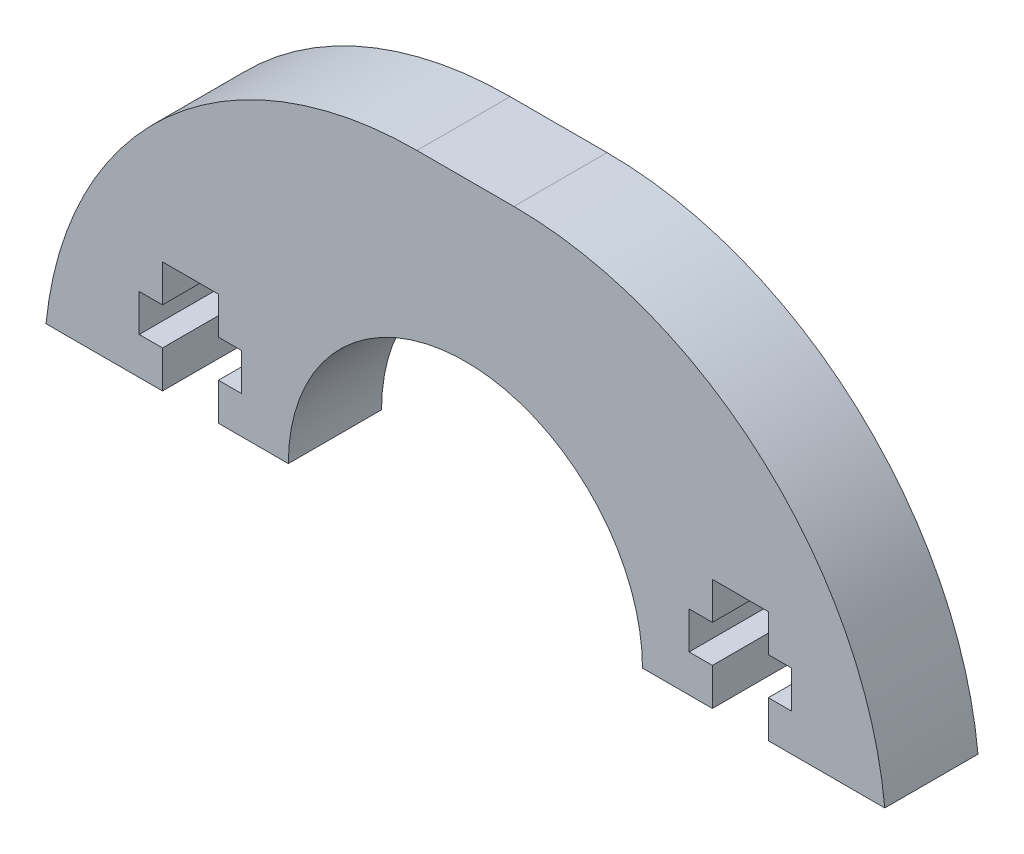
ISO-10303-21;
HEADER;
FILE_DESCRIPTION(('STEP AP214'),'2;1');
FILE_NAME('part.step','',(''),(''),'','','');
FILE_SCHEMA(('AUTOMOTIVE_DESIGN { 1 0 10303 214 1 1 1 1 }'));
ENDSEC;
DATA;
#1=APPLICATION_CONTEXT('core data for automotive mechanical design processes');
#2=APPLICATION_PROTOCOL_DEFINITION('international standard','automotive_design',2000,#1);
#3=PRODUCT_CONTEXT('',#1,'mechanical');
#4=PRODUCT('Part','Part','',(#3));
#5=PRODUCT_RELATED_PRODUCT_CATEGORY('part','',(#4));
#6=PRODUCT_DEFINITION_FORMATION('','',#4);
#7=PRODUCT_DEFINITION_CONTEXT('part definition',#1,'design');
#8=PRODUCT_DEFINITION('design','',#6,#7);
#9=PRODUCT_DEFINITION_SHAPE('','',#8);
#10=(LENGTH_UNIT() NAMED_UNIT(*) SI_UNIT(.MILLI.,.METRE.));
#11=(NAMED_UNIT(*) PLANE_ANGLE_UNIT() SI_UNIT($,.RADIAN.));
#12=(NAMED_UNIT(*) SI_UNIT($,.STERADIAN.) SOLID_ANGLE_UNIT());
#13=UNCERTAINTY_MEASURE_WITH_UNIT(LENGTH_MEASURE(1.E-05),#10,'distance_accuracy_value','');
#14=(GEOMETRIC_REPRESENTATION_CONTEXT(3) GLOBAL_UNCERTAINTY_ASSIGNED_CONTEXT((#13)) GLOBAL_UNIT_ASSIGNED_CONTEXT((#10,
#11,#12)) REPRESENTATION_CONTEXT('',''));
#15=CARTESIAN_POINT('',(0.,0.,0.));
#16=DIRECTION('',(0.,0.,1.));
#17=DIRECTION('',(1.,0.,0.));
#18=AXIS2_PLACEMENT_3D('',#15,#16,#17);
#19=CARTESIAN_POINT('',(0.,-9.,5.));
#20=DIRECTION('',(0.,0.,-1.));
#21=DIRECTION('',(-1.,0.,0.));
#22=AXIS2_PLACEMENT_3D('',#19,#20,#21);
#23=CYLINDRICAL_SURFACE('',#22,9.5);
#24=CARTESIAN_POINT('',(0.,-9.,0.));
#25=DIRECTION('',(0.,0.,1.));
#26=DIRECTION('',(1.,0.,0.));
#27=AXIS2_PLACEMENT_3D('',#24,#25,#26);
#28=CIRCLE('',#27,9.5);
#29=CARTESIAN_POINT('',(9.5,-8.99999999999999,0.));
#30=VERTEX_POINT('',#29);
#31=CARTESIAN_POINT('',(-9.5,-8.99999999999999,0.));
#32=VERTEX_POINT('',#31);
#33=EDGE_CURVE('E234',#30,#32,#28,.T.);
#34=ORIENTED_EDGE('',*,*,#33,.F.);
#35=DIRECTION('',(0.,0.,-1.));
#36=VECTOR('',#35,1.);
#37=CARTESIAN_POINT('',(9.5,-8.99999999999999,5.));
#38=LINE('',#37,#36);
#39=CARTESIAN_POINT('',(9.5,-8.99999999999999,5.));
#40=VERTEX_POINT('',#39);
#41=EDGE_CURVE('E229',#40,#30,#38,.T.);
#42=ORIENTED_EDGE('',*,*,#41,.F.);
#43=CARTESIAN_POINT('',(0.,-9.,5.));
#44=DIRECTION('',(0.,0.,1.));
#45=DIRECTION('',(1.,0.,0.));
#46=AXIS2_PLACEMENT_3D('',#43,#44,#45);
#47=CIRCLE('',#46,9.5);
#48=CARTESIAN_POINT('',(-9.5,-8.99999999999999,5.));
#49=VERTEX_POINT('',#48);
#50=EDGE_CURVE('E231',#40,#49,#47,.T.);
#51=ORIENTED_EDGE('',*,*,#50,.T.);
#52=DIRECTION('',(0.,0.,-1.));
#53=VECTOR('',#52,1.);
#54=CARTESIAN_POINT('',(-9.5,-8.99999999999999,5.));
#55=LINE('',#54,#53);
#56=EDGE_CURVE('E257',#49,#32,#55,.T.);
#57=ORIENTED_EDGE('',*,*,#56,.T.);
#58=EDGE_LOOP('',(#34,#42,#51,#57));
#59=FACE_BOUND('',#58,.T.);
#60=ADVANCED_FACE('F32',(#59),#23,.F.);
#61=CARTESIAN_POINT('',(0.,-8.99999999999999,5.));
#62=DIRECTION('',(0.,-1.,0.));
#63=DIRECTION('',(1.,0.,0.));
#64=AXIS2_PLACEMENT_3D('',#61,#62,#63);
#65=PLANE('',#64);
#66=DIRECTION('',(-1.,0.,0.));
#67=VECTOR('',#66,1.);
#68=CARTESIAN_POINT('',(0.,-8.99999999999999,0.));
#69=LINE('',#68,#67);
#70=CARTESIAN_POINT('',(13.2500000000001,-8.99999999999999,0.));
#71=VERTEX_POINT('',#70);
#72=EDGE_CURVE('E406',#71,#30,#69,.T.);
#73=ORIENTED_EDGE('',*,*,#72,.F.);
#74=DIRECTION('',(0.,0.,-1.));
#75=VECTOR('',#74,1.);
#76=CARTESIAN_POINT('',(13.2500000000001,-8.99999999999999,5.));
#77=LINE('',#76,#75);
#78=CARTESIAN_POINT('',(13.2500000000001,-8.99999999999999,5.));
#79=VERTEX_POINT('',#78);
#80=EDGE_CURVE('E239',#79,#71,#77,.T.);
#81=ORIENTED_EDGE('',*,*,#80,.F.);
#82=DIRECTION('',(-1.,0.,0.));
#83=VECTOR('',#82,1.);
#84=CARTESIAN_POINT('',(0.,-8.99999999999999,5.));
#85=LINE('',#84,#83);
#86=EDGE_CURVE('E244',#79,#40,#85,.T.);
#87=ORIENTED_EDGE('',*,*,#86,.T.);
#88=ORIENTED_EDGE('',*,*,#41,.T.);
#89=EDGE_LOOP('',(#73,#81,#87,#88));
#90=FACE_BOUND('',#89,.T.);
#91=ADVANCED_FACE('F250',(#90),#65,.T.);
#92=CARTESIAN_POINT('',(13.2500000000001,-37.8394982302636,5.));
#93=DIRECTION('',(1.,0.,0.));
#94=DIRECTION('',(0.,0.,-1.));
#95=AXIS2_PLACEMENT_3D('',#92,#93,#94);
#96=PLANE('',#95);
#97=DIRECTION('',(0.,-1.,0.));
#98=VECTOR('',#97,1.);
#99=CARTESIAN_POINT('',(13.2500000000001,-37.8394982302636,0.));
#100=LINE('',#99,#98);
#101=CARTESIAN_POINT('',(13.2500000000001,-6.99999999999999,0.));
#102=VERTEX_POINT('',#101);
#103=EDGE_CURVE('E419',#102,#71,#100,.T.);
#104=ORIENTED_EDGE('',*,*,#103,.F.);
#105=DIRECTION('',(0.,0.,-1.));
#106=VECTOR('',#105,1.);
#107=CARTESIAN_POINT('',(13.2500000000001,-6.99999999999999,5.));
#108=LINE('',#107,#106);
#109=CARTESIAN_POINT('',(13.2500000000001,-6.99999999999999,5.));
#110=VERTEX_POINT('',#109);
#111=EDGE_CURVE('E376',#110,#102,#108,.T.);
#112=ORIENTED_EDGE('',*,*,#111,.F.);
#113=DIRECTION('',(0.,-1.,0.));
#114=VECTOR('',#113,1.);
#115=CARTESIAN_POINT('',(13.2500000000001,-37.8394982302636,5.));
#116=LINE('',#115,#114);
#117=EDGE_CURVE('E251',#110,#79,#116,.T.);
#118=ORIENTED_EDGE('',*,*,#117,.T.);
#119=ORIENTED_EDGE('',*,*,#80,.T.);
#120=EDGE_LOOP('',(#104,#112,#118,#119));
#121=FACE_BOUND('',#120,.T.);
#122=ADVANCED_FACE('F503',(#121),#96,.T.);
#123=CARTESIAN_POINT('',(0.,-6.99999999999999,5.));
#124=DIRECTION('',(0.,1.,0.));
#125=DIRECTION('',(0.,0.,1.));
#126=AXIS2_PLACEMENT_3D('',#123,#124,#125);
#127=PLANE('',#126);
#128=DIRECTION('',(1.,0.,0.));
#129=VECTOR('',#128,1.);
#130=CARTESIAN_POINT('',(0.,-6.99999999999999,0.));
#131=LINE('',#130,#129);
#132=CARTESIAN_POINT('',(12.,-6.99999999999999,0.));
#133=VERTEX_POINT('',#132);
#134=EDGE_CURVE('E421',#133,#102,#131,.T.);
#135=ORIENTED_EDGE('',*,*,#134,.F.);
#136=DIRECTION('',(0.,0.,-1.));
#137=VECTOR('',#136,1.);
#138=CARTESIAN_POINT('',(12.,-6.99999999999999,5.));
#139=LINE('',#138,#137);
#140=CARTESIAN_POINT('',(12.,-6.99999999999999,5.));
#141=VERTEX_POINT('',#140);
#142=EDGE_CURVE('E374',#141,#133,#139,.T.);
#143=ORIENTED_EDGE('',*,*,#142,.F.);
#144=DIRECTION('',(1.,0.,0.));
#145=VECTOR('',#144,1.);
#146=CARTESIAN_POINT('',(0.,-6.99999999999999,5.));
#147=LINE('',#146,#145);
#148=EDGE_CURVE('E254',#141,#110,#147,.T.);
#149=ORIENTED_EDGE('',*,*,#148,.T.);
#150=ORIENTED_EDGE('',*,*,#111,.T.);
#151=EDGE_LOOP('',(#135,#143,#149,#150));
#152=FACE_BOUND('',#151,.T.);
#153=ADVANCED_FACE('F665',(#152),#127,.T.);
#154=CARTESIAN_POINT('',(12.,-37.8394982302636,5.));
#155=DIRECTION('',(1.,0.,0.));
#156=DIRECTION('',(0.,0.,-1.));
#157=AXIS2_PLACEMENT_3D('',#154,#155,#156);
#158=PLANE('',#157);
#159=DIRECTION('',(0.,-1.,0.));
#160=VECTOR('',#159,1.);
#161=CARTESIAN_POINT('',(12.,-37.8394982302636,0.));
#162=LINE('',#161,#160);
#163=CARTESIAN_POINT('',(12.,-4.99999999999999,0.));
#164=VERTEX_POINT('',#163);
#165=EDGE_CURVE('E468',#164,#133,#162,.T.);
#166=ORIENTED_EDGE('',*,*,#165,.F.);
#167=DIRECTION('',(0.,0.,-1.));
#168=VECTOR('',#167,1.);
#169=CARTESIAN_POINT('',(12.,-4.99999999999999,5.));
#170=LINE('',#169,#168);
#171=CARTESIAN_POINT('',(12.,-4.99999999999999,5.));
#172=VERTEX_POINT('',#171);
#173=EDGE_CURVE('E372',#172,#164,#170,.T.);
#174=ORIENTED_EDGE('',*,*,#173,.F.);
#175=DIRECTION('',(0.,-1.,0.));
#176=VECTOR('',#175,1.);
#177=CARTESIAN_POINT('',(12.,-37.8394982302636,5.));
#178=LINE('',#177,#176);
#179=EDGE_CURVE('E765',#172,#141,#178,.T.);
#180=ORIENTED_EDGE('',*,*,#179,.T.);
#181=ORIENTED_EDGE('',*,*,#142,.T.);
#182=EDGE_LOOP('',(#166,#174,#180,#181));
#183=FACE_BOUND('',#182,.T.);
#184=ADVANCED_FACE('F505',(#183),#158,.T.);
#185=CARTESIAN_POINT('',(0.,-4.99999999999999,5.));
#186=DIRECTION('',(0.,1.,0.));
#187=DIRECTION('',(0.,0.,1.));
#188=AXIS2_PLACEMENT_3D('',#185,#186,#187);
#189=PLANE('',#188);
#190=DIRECTION('',(1.,0.,0.));
#191=VECTOR('',#190,1.);
#192=CARTESIAN_POINT('',(0.,-4.99999999999999,0.));
#193=LINE('',#192,#191);
#194=CARTESIAN_POINT('',(13.2500000000001,-4.99999999999999,0.));
#195=VERTEX_POINT('',#194);
#196=EDGE_CURVE('E465',#164,#195,#193,.T.);
#197=ORIENTED_EDGE('',*,*,#196,.T.);
#198=DIRECTION('',(0.,0.,-1.));
#199=VECTOR('',#198,1.);
#200=CARTESIAN_POINT('',(13.2500000000001,-4.99999999999999,5.));
#201=LINE('',#200,#199);
#202=CARTESIAN_POINT('',(13.2500000000001,-4.99999999999999,5.));
#203=VERTEX_POINT('',#202);
#204=EDGE_CURVE('E370',#203,#195,#201,.T.);
#205=ORIENTED_EDGE('',*,*,#204,.F.);
#206=DIRECTION('',(1.,0.,0.));
#207=VECTOR('',#206,1.);
#208=CARTESIAN_POINT('',(0.,-4.99999999999999,5.));
#209=LINE('',#208,#207);
#210=EDGE_CURVE('E767',#172,#203,#209,.T.);
#211=ORIENTED_EDGE('',*,*,#210,.F.);
#212=ORIENTED_EDGE('',*,*,#173,.T.);
#213=EDGE_LOOP('',(#197,#205,#211,#212));
#214=FACE_BOUND('',#213,.T.);
#215=ADVANCED_FACE('F681',(#214),#189,.F.);
#216=CARTESIAN_POINT('',(13.2500000000001,-3.,0.));
#217=VERTEX_POINT('',#216);
#218=EDGE_CURVE('E422',#217,#195,#100,.T.);
#219=ORIENTED_EDGE('',*,*,#218,.F.);
#220=DIRECTION('',(0.,0.,-1.));
#221=VECTOR('',#220,1.);
#222=CARTESIAN_POINT('',(13.2500000000001,-3.,5.));
#223=LINE('',#222,#221);
#224=CARTESIAN_POINT('',(13.2500000000001,-3.,5.));
#225=VERTEX_POINT('',#224);
#226=EDGE_CURVE('E368',#225,#217,#223,.T.);
#227=ORIENTED_EDGE('',*,*,#226,.F.);
#228=EDGE_CURVE('E256',#225,#203,#116,.T.);
#229=ORIENTED_EDGE('',*,*,#228,.T.);
#230=ORIENTED_EDGE('',*,*,#204,.T.);
#231=EDGE_LOOP('',(#219,#227,#229,#230));
#232=FACE_BOUND('',#231,.T.);
#233=ADVANCED_FACE('F694',(#232),#96,.T.);
#234=CARTESIAN_POINT('',(0.,-3.,5.));
#235=DIRECTION('',(0.,-1.,0.));
#236=DIRECTION('',(0.,0.,-1.));
#237=AXIS2_PLACEMENT_3D('',#234,#235,#236);
#238=PLANE('',#237);
#239=DIRECTION('',(-1.,0.,0.));
#240=VECTOR('',#239,1.);
#241=CARTESIAN_POINT('',(0.,-3.,0.));
#242=LINE('',#241,#240);
#243=CARTESIAN_POINT('',(16.2500000000001,-3.,0.));
#244=VERTEX_POINT('',#243);
#245=EDGE_CURVE('E462',#244,#217,#242,.T.);
#246=ORIENTED_EDGE('',*,*,#245,.F.);
#247=DIRECTION('',(0.,0.,-1.));
#248=VECTOR('',#247,1.);
#249=CARTESIAN_POINT('',(16.2500000000001,-3.,5.));
#250=LINE('',#249,#248);
#251=CARTESIAN_POINT('',(16.2500000000001,-3.,5.));
#252=VERTEX_POINT('',#251);
#253=EDGE_CURVE('E366',#252,#244,#250,.T.);
#254=ORIENTED_EDGE('',*,*,#253,.F.);
#255=DIRECTION('',(-1.,0.,0.));
#256=VECTOR('',#255,1.);
#257=CARTESIAN_POINT('',(0.,-3.,5.));
#258=LINE('',#257,#256);
#259=EDGE_CURVE('E778',#252,#225,#258,.T.);
#260=ORIENTED_EDGE('',*,*,#259,.T.);
#261=ORIENTED_EDGE('',*,*,#226,.T.);
#262=EDGE_LOOP('',(#246,#254,#260,#261));
#263=FACE_BOUND('',#262,.T.);
#264=ADVANCED_FACE('F687',(#263),#238,.T.);
#265=CARTESIAN_POINT('',(16.2500000000001,-37.8394982302636,5.));
#266=DIRECTION('',(1.,0.,0.));
#267=DIRECTION('',(0.,0.,-1.));
#268=AXIS2_PLACEMENT_3D('',#265,#266,#267);
#269=PLANE('',#268);
#270=DIRECTION('',(0.,-1.,0.));
#271=VECTOR('',#270,1.);
#272=CARTESIAN_POINT('',(16.2500000000001,-37.8394982302636,0.));
#273=LINE('',#272,#271);
#274=CARTESIAN_POINT('',(16.2500000000001,-4.99999999999999,0.));
#275=VERTEX_POINT('',#274);
#276=EDGE_CURVE('E460',#244,#275,#273,.T.);
#277=ORIENTED_EDGE('',*,*,#276,.T.);
#278=DIRECTION('',(0.,0.,-1.));
#279=VECTOR('',#278,1.);
#280=CARTESIAN_POINT('',(16.2500000000001,-4.99999999999999,5.));
#281=LINE('',#280,#279);
#282=CARTESIAN_POINT('',(16.2500000000001,-4.99999999999999,5.));
#283=VERTEX_POINT('',#282);
#284=EDGE_CURVE('E363',#283,#275,#281,.T.);
#285=ORIENTED_EDGE('',*,*,#284,.F.);
#286=DIRECTION('',(0.,-1.,0.));
#287=VECTOR('',#286,1.);
#288=CARTESIAN_POINT('',(16.2500000000001,-37.8394982302636,5.));
#289=LINE('',#288,#287);
#290=EDGE_CURVE('E267',#252,#283,#289,.T.);
#291=ORIENTED_EDGE('',*,*,#290,.F.);
#292=ORIENTED_EDGE('',*,*,#253,.T.);
#293=EDGE_LOOP('',(#277,#285,#291,#292));
#294=FACE_BOUND('',#293,.T.);
#295=ADVANCED_FACE('F657',(#294),#269,.F.);
#296=CARTESIAN_POINT('',(17.5,-4.99999999999999,0.));
#297=VERTEX_POINT('',#296);
#298=EDGE_CURVE('E459',#275,#297,#193,.T.);
#299=ORIENTED_EDGE('',*,*,#298,.T.);
#300=DIRECTION('',(0.,0.,-1.));
#301=VECTOR('',#300,1.);
#302=CARTESIAN_POINT('',(17.5,-4.99999999999999,5.));
#303=LINE('',#302,#301);
#304=CARTESIAN_POINT('',(17.5,-4.99999999999999,5.));
#305=VERTEX_POINT('',#304);
#306=EDGE_CURVE('E360',#305,#297,#303,.T.);
#307=ORIENTED_EDGE('',*,*,#306,.F.);
#308=EDGE_CURVE('E772',#283,#305,#209,.T.);
#309=ORIENTED_EDGE('',*,*,#308,.F.);
#310=ORIENTED_EDGE('',*,*,#284,.T.);
#311=EDGE_LOOP('',(#299,#307,#309,#310));
#312=FACE_BOUND('',#311,.T.);
#313=ADVANCED_FACE('F671',(#312),#189,.F.);
#314=CARTESIAN_POINT('',(17.5,-37.8394982302636,5.));
#315=DIRECTION('',(1.,0.,0.));
#316=DIRECTION('',(0.,0.,-1.));
#317=AXIS2_PLACEMENT_3D('',#314,#315,#316);
#318=PLANE('',#317);
#319=DIRECTION('',(0.,-1.,0.));
#320=VECTOR('',#319,1.);
#321=CARTESIAN_POINT('',(17.5,-37.8394982302636,0.));
#322=LINE('',#321,#320);
#323=CARTESIAN_POINT('',(17.5,-6.99999999999999,0.));
#324=VERTEX_POINT('',#323);
#325=EDGE_CURVE('E455',#297,#324,#322,.T.);
#326=ORIENTED_EDGE('',*,*,#325,.T.);
#327=DIRECTION('',(0.,0.,-1.));
#328=VECTOR('',#327,1.);
#329=CARTESIAN_POINT('',(17.5,-6.99999999999999,5.));
#330=LINE('',#329,#328);
#331=CARTESIAN_POINT('',(17.5,-6.99999999999999,5.));
#332=VERTEX_POINT('',#331);
#333=EDGE_CURVE('E358',#332,#324,#330,.T.);
#334=ORIENTED_EDGE('',*,*,#333,.F.);
#335=DIRECTION('',(0.,-1.,0.));
#336=VECTOR('',#335,1.);
#337=CARTESIAN_POINT('',(17.5,-37.8394982302636,5.));
#338=LINE('',#337,#336);
#339=EDGE_CURVE('E770',#305,#332,#338,.T.);
#340=ORIENTED_EDGE('',*,*,#339,.F.);
#341=ORIENTED_EDGE('',*,*,#306,.T.);
#342=EDGE_LOOP('',(#326,#334,#340,#341));
#343=FACE_BOUND('',#342,.T.);
#344=ADVANCED_FACE('F662',(#343),#318,.F.);
#345=CARTESIAN_POINT('',(16.2500000000001,-6.99999999999999,0.));
#346=VERTEX_POINT('',#345);
#347=EDGE_CURVE('E458',#346,#324,#131,.T.);
#348=ORIENTED_EDGE('',*,*,#347,.F.);
#349=DIRECTION('',(0.,0.,-1.));
#350=VECTOR('',#349,1.);
#351=CARTESIAN_POINT('',(16.2500000000001,-6.99999999999999,5.));
#352=LINE('',#351,#350);
#353=CARTESIAN_POINT('',(16.2500000000001,-6.99999999999999,5.));
#354=VERTEX_POINT('',#353);
#355=EDGE_CURVE('E356',#354,#346,#352,.T.);
#356=ORIENTED_EDGE('',*,*,#355,.F.);
#357=EDGE_CURVE('E265',#354,#332,#147,.T.);
#358=ORIENTED_EDGE('',*,*,#357,.T.);
#359=ORIENTED_EDGE('',*,*,#333,.T.);
#360=EDGE_LOOP('',(#348,#356,#358,#359));
#361=FACE_BOUND('',#360,.T.);
#362=ADVANCED_FACE('F656',(#361),#127,.T.);
#363=CARTESIAN_POINT('',(16.2500000000001,-8.99999999999999,0.));
#364=VERTEX_POINT('',#363);
#365=EDGE_CURVE('E410',#346,#364,#273,.T.);
#366=ORIENTED_EDGE('',*,*,#365,.T.);
#367=DIRECTION('',(0.,0.,-1.));
#368=VECTOR('',#367,1.);
#369=CARTESIAN_POINT('',(16.2500000000001,-8.99999999999999,5.));
#370=LINE('',#369,#368);
#371=CARTESIAN_POINT('',(16.2500000000001,-8.99999999999999,5.));
#372=VERTEX_POINT('',#371);
#373=EDGE_CURVE('E354',#372,#364,#370,.T.);
#374=ORIENTED_EDGE('',*,*,#373,.F.);
#375=EDGE_CURVE('E262',#354,#372,#289,.T.);
#376=ORIENTED_EDGE('',*,*,#375,.F.);
#377=ORIENTED_EDGE('',*,*,#355,.T.);
#378=EDGE_LOOP('',(#366,#374,#376,#377));
#379=FACE_BOUND('',#378,.T.);
#380=ADVANCED_FACE('F480',(#379),#269,.F.);
#381=CARTESIAN_POINT('',(22.5,-8.99999999999999,0.));
#382=VERTEX_POINT('',#381);
#383=EDGE_CURVE('E401',#382,#364,#69,.T.);
#384=ORIENTED_EDGE('',*,*,#383,.F.);
#385=DIRECTION('',(0.,0.,-1.));
#386=VECTOR('',#385,1.);
#387=CARTESIAN_POINT('',(22.5,-8.99999999999999,5.));
#388=LINE('',#387,#386);
#389=CARTESIAN_POINT('',(22.5,-8.99999999999999,5.));
#390=VERTEX_POINT('',#389);
#391=EDGE_CURVE('E351',#390,#382,#388,.T.);
#392=ORIENTED_EDGE('',*,*,#391,.F.);
#393=EDGE_CURVE('E253',#390,#372,#85,.T.);
#394=ORIENTED_EDGE('',*,*,#393,.T.);
#395=ORIENTED_EDGE('',*,*,#373,.T.);
#396=EDGE_LOOP('',(#384,#392,#394,#395));
#397=FACE_BOUND('',#396,.T.);
#398=ADVANCED_FACE('F483',(#397),#65,.T.);
#399=CARTESIAN_POINT('',(0.,9.,5.));
#400=DIRECTION('',(0.,-1.,0.));
#401=DIRECTION('',(0.,0.,-1.));
#402=AXIS2_PLACEMENT_3D('',#399,#400,#401);
#403=PLANE('',#402);
#404=DIRECTION('',(-1.,0.,0.));
#405=VECTOR('',#404,1.);
#406=CARTESIAN_POINT('',(0.,9.,5.));
#407=LINE('',#406,#405);
#408=CARTESIAN_POINT('',(2.6002512578676,9.,5.));
#409=VERTEX_POINT('',#408);
#410=CARTESIAN_POINT('',(-2.60025125786761,9.,5.));
#411=VERTEX_POINT('',#410);
#412=EDGE_CURVE('E261',#409,#411,#407,.T.);
#413=ORIENTED_EDGE('',*,*,#412,.F.);
#414=DIRECTION('',(0.,0.,-1.));
#415=VECTOR('',#414,1.);
#416=CARTESIAN_POINT('',(2.6002512578676,9.,5.));
#417=LINE('',#416,#415);
#418=CARTESIAN_POINT('',(2.6002512578676,9.,0.));
#419=VERTEX_POINT('',#418);
#420=EDGE_CURVE('E380',#409,#419,#417,.T.);
#421=ORIENTED_EDGE('',*,*,#420,.T.);
#422=DIRECTION('',(-1.,0.,0.));
#423=VECTOR('',#422,1.);
#424=CARTESIAN_POINT('',(0.,9.,0.));
#425=LINE('',#424,#423);
#426=CARTESIAN_POINT('',(-2.60025125786761,9.,0.));
#427=VERTEX_POINT('',#426);
#428=EDGE_CURVE('E399',#419,#427,#425,.T.);
#429=ORIENTED_EDGE('',*,*,#428,.T.);
#430=DIRECTION('',(0.,0.,-1.));
#431=VECTOR('',#430,1.);
#432=CARTESIAN_POINT('',(-2.60025125786761,9.,5.));
#433=LINE('',#432,#431);
#434=EDGE_CURVE('E47',#427,#411,#433,.F.);
#435=ORIENTED_EDGE('',*,*,#434,.T.);
#436=EDGE_LOOP('',(#413,#421,#429,#435));
#437=FACE_BOUND('',#436,.T.);
#438=ADVANCED_FACE('F487',(#437),#403,.F.);
#439=CARTESIAN_POINT('',(-16.2499999999999,-8.99999999999999,0.));
#440=VERTEX_POINT('',#439);
#441=CARTESIAN_POINT('',(-22.5,-8.99999999999999,0.));
#442=VERTEX_POINT('',#441);
#443=EDGE_CURVE('E391',#440,#442,#69,.T.);
#444=ORIENTED_EDGE('',*,*,#443,.F.);
#445=DIRECTION('',(0.,0.,-1.));
#446=VECTOR('',#445,1.);
#447=CARTESIAN_POINT('',(-16.2499999999999,-8.99999999999999,5.));
#448=LINE('',#447,#446);
#449=CARTESIAN_POINT('',(-16.2499999999999,-8.99999999999999,5.));
#450=VERTEX_POINT('',#449);
#451=EDGE_CURVE('E347',#450,#440,#448,.T.);
#452=ORIENTED_EDGE('',*,*,#451,.F.);
#453=CARTESIAN_POINT('',(-22.5,-8.99999999999999,5.));
#454=VERTEX_POINT('',#453);
#455=EDGE_CURVE('E259',#450,#454,#85,.T.);
#456=ORIENTED_EDGE('',*,*,#455,.T.);
#457=DIRECTION('',(0.,0.,-1.));
#458=VECTOR('',#457,1.);
#459=CARTESIAN_POINT('',(-22.5,-8.99999999999999,5.));
#460=LINE('',#459,#458);
#461=EDGE_CURVE('E349',#454,#442,#460,.T.);
#462=ORIENTED_EDGE('',*,*,#461,.T.);
#463=EDGE_LOOP('',(#444,#452,#456,#462));
#464=FACE_BOUND('',#463,.T.);
#465=ADVANCED_FACE('F390',(#464),#65,.T.);
#466=CARTESIAN_POINT('',(-16.2499999999999,-37.8394982302636,5.));
#467=DIRECTION('',(1.,0.,0.));
#468=DIRECTION('',(0.,0.,-1.));
#469=AXIS2_PLACEMENT_3D('',#466,#467,#468);
#470=PLANE('',#469);
#471=DIRECTION('',(0.,-1.,0.));
#472=VECTOR('',#471,1.);
#473=CARTESIAN_POINT('',(-16.2499999999999,-37.8394982302636,0.));
#474=LINE('',#473,#472);
#475=CARTESIAN_POINT('',(-16.2499999999999,-6.99999999999999,0.));
#476=VERTEX_POINT('',#475);
#477=EDGE_CURVE('E398',#476,#440,#474,.T.);
#478=ORIENTED_EDGE('',*,*,#477,.F.);
#479=DIRECTION('',(0.,0.,-1.));
#480=VECTOR('',#479,1.);
#481=CARTESIAN_POINT('',(-16.2499999999999,-6.99999999999999,5.));
#482=LINE('',#481,#480);
#483=CARTESIAN_POINT('',(-16.2499999999999,-6.99999999999999,5.));
#484=VERTEX_POINT('',#483);
#485=EDGE_CURVE('E345',#484,#476,#482,.T.);
#486=ORIENTED_EDGE('',*,*,#485,.F.);
#487=DIRECTION('',(0.,-1.,0.));
#488=VECTOR('',#487,1.);
#489=CARTESIAN_POINT('',(-16.2499999999999,-37.8394982302636,5.));
#490=LINE('',#489,#488);
#491=EDGE_CURVE('E269',#484,#450,#490,.T.);
#492=ORIENTED_EDGE('',*,*,#491,.T.);
#493=ORIENTED_EDGE('',*,*,#451,.T.);
#494=EDGE_LOOP('',(#478,#486,#492,#493));
#495=FACE_BOUND('',#494,.T.);
#496=ADVANCED_FACE('F494',(#495),#470,.T.);
#497=CARTESIAN_POINT('',(0.,-6.99999999999999,5.));
#498=DIRECTION('',(0.,1.,0.));
#499=DIRECTION('',(0.,0.,1.));
#500=AXIS2_PLACEMENT_3D('',#497,#498,#499);
#501=PLANE('',#500);
#502=DIRECTION('',(1.,0.,0.));
#503=VECTOR('',#502,1.);
#504=CARTESIAN_POINT('',(0.,-6.99999999999999,0.));
#505=LINE('',#504,#503);
#506=CARTESIAN_POINT('',(-17.5,-6.99999999999999,0.));
#507=VERTEX_POINT('',#506);
#508=EDGE_CURVE('E402',#507,#476,#505,.T.);
#509=ORIENTED_EDGE('',*,*,#508,.F.);
#510=DIRECTION('',(0.,0.,-1.));
#511=VECTOR('',#510,1.);
#512=CARTESIAN_POINT('',(-17.5,-6.99999999999999,5.));
#513=LINE('',#512,#511);
#514=CARTESIAN_POINT('',(-17.5,-6.99999999999999,5.));
#515=VERTEX_POINT('',#514);
#516=EDGE_CURVE('E343',#515,#507,#513,.T.);
#517=ORIENTED_EDGE('',*,*,#516,.F.);
#518=DIRECTION('',(1.,0.,0.));
#519=VECTOR('',#518,1.);
#520=CARTESIAN_POINT('',(0.,-6.99999999999999,5.));
#521=LINE('',#520,#519);
#522=EDGE_CURVE('E275',#515,#484,#521,.T.);
#523=ORIENTED_EDGE('',*,*,#522,.T.);
#524=ORIENTED_EDGE('',*,*,#485,.T.);
#525=EDGE_LOOP('',(#509,#517,#523,#524));
#526=FACE_BOUND('',#525,.T.);
#527=ADVANCED_FACE('F524',(#526),#501,.T.);
#528=CARTESIAN_POINT('',(-17.5,-37.8394982302637,5.));
#529=DIRECTION('',(1.,0.,0.));
#530=DIRECTION('',(0.,1.,0.));
#531=AXIS2_PLACEMENT_3D('',#528,#529,#530);
#532=PLANE('',#531);
#533=DIRECTION('',(0.,-1.,0.));
#534=VECTOR('',#533,1.);
#535=CARTESIAN_POINT('',(-17.5,-37.8394982302637,0.));
#536=LINE('',#535,#534);
#537=CARTESIAN_POINT('',(-17.5,-4.99999999999999,0.));
#538=VERTEX_POINT('',#537);
#539=EDGE_CURVE('E431',#538,#507,#536,.T.);
#540=ORIENTED_EDGE('',*,*,#539,.F.);
#541=DIRECTION('',(0.,0.,-1.));
#542=VECTOR('',#541,1.);
#543=CARTESIAN_POINT('',(-17.5,-4.99999999999999,5.));
#544=LINE('',#543,#542);
#545=CARTESIAN_POINT('',(-17.5,-4.99999999999999,5.));
#546=VERTEX_POINT('',#545);
#547=EDGE_CURVE('E341',#546,#538,#544,.T.);
#548=ORIENTED_EDGE('',*,*,#547,.F.);
#549=DIRECTION('',(0.,-1.,0.));
#550=VECTOR('',#549,1.);
#551=CARTESIAN_POINT('',(-17.5,-37.8394982302637,5.));
#552=LINE('',#551,#550);
#553=EDGE_CURVE('E281',#546,#515,#552,.T.);
#554=ORIENTED_EDGE('',*,*,#553,.T.);
#555=ORIENTED_EDGE('',*,*,#516,.T.);
#556=EDGE_LOOP('',(#540,#548,#554,#555));
#557=FACE_BOUND('',#556,.T.);
#558=ADVANCED_FACE('F533',(#557),#532,.T.);
#559=CARTESIAN_POINT('',(0.,-4.99999999999999,5.));
#560=DIRECTION('',(0.,1.,0.));
#561=DIRECTION('',(0.,0.,1.));
#562=AXIS2_PLACEMENT_3D('',#559,#560,#561);
#563=PLANE('',#562);
#564=DIRECTION('',(1.,0.,0.));
#565=VECTOR('',#564,1.);
#566=CARTESIAN_POINT('',(0.,-4.99999999999999,0.));
#567=LINE('',#566,#565);
#568=CARTESIAN_POINT('',(-16.2499999999999,-4.99999999999999,0.));
#569=VERTEX_POINT('',#568);
#570=EDGE_CURVE('E434',#538,#569,#567,.T.);
#571=ORIENTED_EDGE('',*,*,#570,.T.);
#572=DIRECTION('',(0.,0.,-1.));
#573=VECTOR('',#572,1.);
#574=CARTESIAN_POINT('',(-16.2499999999999,-4.99999999999999,5.));
#575=LINE('',#574,#573);
#576=CARTESIAN_POINT('',(-16.2499999999999,-4.99999999999999,5.));
#577=VERTEX_POINT('',#576);
#578=EDGE_CURVE('E339',#577,#569,#575,.T.);
#579=ORIENTED_EDGE('',*,*,#578,.F.);
#580=DIRECTION('',(1.,0.,0.));
#581=VECTOR('',#580,1.);
#582=CARTESIAN_POINT('',(0.,-4.99999999999999,5.));
#583=LINE('',#582,#581);
#584=EDGE_CURVE('E286',#546,#577,#583,.T.);
#585=ORIENTED_EDGE('',*,*,#584,.F.);
#586=ORIENTED_EDGE('',*,*,#547,.T.);
#587=EDGE_LOOP('',(#571,#579,#585,#586));
#588=FACE_BOUND('',#587,.T.);
#589=ADVANCED_FACE('F529',(#588),#563,.F.);
#590=CARTESIAN_POINT('',(-16.2499999999999,-3.,0.));
#591=VERTEX_POINT('',#590);
#592=EDGE_CURVE('E404',#591,#569,#474,.T.);
#593=ORIENTED_EDGE('',*,*,#592,.F.);
#594=DIRECTION('',(0.,0.,-1.));
#595=VECTOR('',#594,1.);
#596=CARTESIAN_POINT('',(-16.2499999999999,-3.,5.));
#597=LINE('',#596,#595);
#598=CARTESIAN_POINT('',(-16.2499999999999,-3.,5.));
#599=VERTEX_POINT('',#598);
#600=EDGE_CURVE('E337',#599,#591,#597,.T.);
#601=ORIENTED_EDGE('',*,*,#600,.F.);
#602=EDGE_CURVE('E277',#599,#577,#490,.T.);
#603=ORIENTED_EDGE('',*,*,#602,.T.);
#604=ORIENTED_EDGE('',*,*,#578,.T.);
#605=EDGE_LOOP('',(#593,#601,#603,#604));
#606=FACE_BOUND('',#605,.T.);
#607=ADVANCED_FACE('F453',(#606),#470,.T.);
#608=CARTESIAN_POINT('',(0.,-3.,5.));
#609=DIRECTION('',(0.,-1.,0.));
#610=DIRECTION('',(0.,0.,-1.));
#611=AXIS2_PLACEMENT_3D('',#608,#609,#610);
#612=PLANE('',#611);
#613=DIRECTION('',(-1.,0.,0.));
#614=VECTOR('',#613,1.);
#615=CARTESIAN_POINT('',(0.,-3.,0.));
#616=LINE('',#615,#614);
#617=CARTESIAN_POINT('',(-13.2499999999999,-3.,0.));
#618=VERTEX_POINT('',#617);
#619=EDGE_CURVE('E440',#618,#591,#616,.T.);
#620=ORIENTED_EDGE('',*,*,#619,.F.);
#621=DIRECTION('',(0.,0.,-1.));
#622=VECTOR('',#621,1.);
#623=CARTESIAN_POINT('',(-13.2499999999999,-3.,5.));
#624=LINE('',#623,#622);
#625=CARTESIAN_POINT('',(-13.2499999999999,-3.,5.));
#626=VERTEX_POINT('',#625);
#627=EDGE_CURVE('E335',#626,#618,#624,.T.);
#628=ORIENTED_EDGE('',*,*,#627,.F.);
#629=DIRECTION('',(-1.,0.,0.));
#630=VECTOR('',#629,1.);
#631=CARTESIAN_POINT('',(0.,-3.,5.));
#632=LINE('',#631,#630);
#633=EDGE_CURVE('E285',#626,#599,#632,.T.);
#634=ORIENTED_EDGE('',*,*,#633,.T.);
#635=ORIENTED_EDGE('',*,*,#600,.T.);
#636=EDGE_LOOP('',(#620,#628,#634,#635));
#637=FACE_BOUND('',#636,.T.);
#638=ADVANCED_FACE('F451',(#637),#612,.T.);
#639=CARTESIAN_POINT('',(-13.2499999999999,-37.8394982302636,5.));
#640=DIRECTION('',(1.,0.,0.));
#641=DIRECTION('',(0.,0.,-1.));
#642=AXIS2_PLACEMENT_3D('',#639,#640,#641);
#643=PLANE('',#642);
#644=DIRECTION('',(0.,-1.,0.));
#645=VECTOR('',#644,1.);
#646=CARTESIAN_POINT('',(-13.2499999999999,-37.8394982302636,0.));
#647=LINE('',#646,#645);
#648=CARTESIAN_POINT('',(-13.2499999999999,-4.99999999999999,0.));
#649=VERTEX_POINT('',#648);
#650=EDGE_CURVE('E418',#618,#649,#647,.T.);
#651=ORIENTED_EDGE('',*,*,#650,.T.);
#652=DIRECTION('',(0.,0.,-1.));
#653=VECTOR('',#652,1.);
#654=CARTESIAN_POINT('',(-13.2499999999999,-4.99999999999999,5.));
#655=LINE('',#654,#653);
#656=CARTESIAN_POINT('',(-13.2499999999999,-4.99999999999999,5.));
#657=VERTEX_POINT('',#656);
#658=EDGE_CURVE('E327',#657,#649,#655,.T.);
#659=ORIENTED_EDGE('',*,*,#658,.F.);
#660=DIRECTION('',(0.,-1.,0.));
#661=VECTOR('',#660,1.);
#662=CARTESIAN_POINT('',(-13.2499999999999,-37.8394982302636,5.));
#663=LINE('',#662,#661);
#664=EDGE_CURVE('E290',#626,#657,#663,.T.);
#665=ORIENTED_EDGE('',*,*,#664,.F.);
#666=ORIENTED_EDGE('',*,*,#627,.T.);
#667=EDGE_LOOP('',(#651,#659,#665,#666));
#668=FACE_BOUND('',#667,.T.);
#669=ADVANCED_FACE('F521',(#668),#643,.F.);
#670=CARTESIAN_POINT('',(-12.,-4.99999999999999,0.));
#671=VERTEX_POINT('',#670);
#672=EDGE_CURVE('E428',#649,#671,#567,.T.);
#673=ORIENTED_EDGE('',*,*,#672,.T.);
#674=DIRECTION('',(0.,0.,-1.));
#675=VECTOR('',#674,1.);
#676=CARTESIAN_POINT('',(-12.,-4.99999999999999,5.));
#677=LINE('',#676,#675);
#678=CARTESIAN_POINT('',(-12.,-4.99999999999999,5.));
#679=VERTEX_POINT('',#678);
#680=EDGE_CURVE('E325',#679,#671,#677,.T.);
#681=ORIENTED_EDGE('',*,*,#680,.F.);
#682=EDGE_CURVE('E293',#657,#679,#583,.T.);
#683=ORIENTED_EDGE('',*,*,#682,.F.);
#684=ORIENTED_EDGE('',*,*,#658,.T.);
#685=EDGE_LOOP('',(#673,#681,#683,#684));
#686=FACE_BOUND('',#685,.T.);
#687=ADVANCED_FACE('F447',(#686),#563,.F.);
#688=CARTESIAN_POINT('',(-12.,-37.8394982302636,5.));
#689=DIRECTION('',(1.,0.,0.));
#690=DIRECTION('',(0.,0.,-1.));
#691=AXIS2_PLACEMENT_3D('',#688,#689,#690);
#692=PLANE('',#691);
#693=DIRECTION('',(0.,-1.,0.));
#694=VECTOR('',#693,1.);
#695=CARTESIAN_POINT('',(-12.,-37.8394982302636,0.));
#696=LINE('',#695,#694);
#697=CARTESIAN_POINT('',(-12.,-6.99999999999999,0.));
#698=VERTEX_POINT('',#697);
#699=EDGE_CURVE('E323',#671,#698,#696,.T.);
#700=ORIENTED_EDGE('',*,*,#699,.T.);
#701=DIRECTION('',(0.,0.,-1.));
#702=VECTOR('',#701,1.);
#703=CARTESIAN_POINT('',(-12.,-6.99999999999999,5.));
#704=LINE('',#703,#702);
#705=CARTESIAN_POINT('',(-12.,-6.99999999999999,5.));
#706=VERTEX_POINT('',#705);
#707=EDGE_CURVE('E315',#706,#698,#704,.T.);
#708=ORIENTED_EDGE('',*,*,#707,.F.);
#709=DIRECTION('',(0.,-1.,0.));
#710=VECTOR('',#709,1.);
#711=CARTESIAN_POINT('',(-12.,-37.8394982302636,5.));
#712=LINE('',#711,#710);
#713=EDGE_CURVE('E299',#679,#706,#712,.T.);
#714=ORIENTED_EDGE('',*,*,#713,.F.);
#715=ORIENTED_EDGE('',*,*,#680,.T.);
#716=EDGE_LOOP('',(#700,#708,#714,#715));
#717=FACE_BOUND('',#716,.T.);
#718=ADVANCED_FACE('F321',(#717),#692,.F.);
#719=CARTESIAN_POINT('',(-13.2499999999999,-6.99999999999999,0.));
#720=VERTEX_POINT('',#719);
#721=EDGE_CURVE('E416',#720,#698,#505,.T.);
#722=ORIENTED_EDGE('',*,*,#721,.F.);
#723=DIRECTION('',(0.,0.,-1.));
#724=VECTOR('',#723,1.);
#725=CARTESIAN_POINT('',(-13.2499999999999,-6.99999999999999,5.));
#726=LINE('',#725,#724);
#727=CARTESIAN_POINT('',(-13.2499999999999,-6.99999999999999,5.));
#728=VERTEX_POINT('',#727);
#729=EDGE_CURVE('E317',#728,#720,#726,.T.);
#730=ORIENTED_EDGE('',*,*,#729,.F.);
#731=EDGE_CURVE('E283',#728,#706,#521,.T.);
#732=ORIENTED_EDGE('',*,*,#731,.T.);
#733=ORIENTED_EDGE('',*,*,#707,.T.);
#734=EDGE_LOOP('',(#722,#730,#732,#733));
#735=FACE_BOUND('',#734,.T.);
#736=ADVANCED_FACE('F313',(#735),#501,.T.);
#737=CARTESIAN_POINT('',(-13.2499999999999,-8.99999999999999,0.));
#738=VERTEX_POINT('',#737);
#739=EDGE_CURVE('E412',#720,#738,#647,.T.);
#740=ORIENTED_EDGE('',*,*,#739,.T.);
#741=DIRECTION('',(0.,0.,-1.));
#742=VECTOR('',#741,1.);
#743=CARTESIAN_POINT('',(-13.2499999999999,-8.99999999999999,5.));
#744=LINE('',#743,#742);
#745=CARTESIAN_POINT('',(-13.2499999999999,-8.99999999999999,5.));
#746=VERTEX_POINT('',#745);
#747=EDGE_CURVE('E329',#746,#738,#744,.T.);
#748=ORIENTED_EDGE('',*,*,#747,.F.);
#749=EDGE_CURVE('E258',#728,#746,#663,.T.);
#750=ORIENTED_EDGE('',*,*,#749,.F.);
#751=ORIENTED_EDGE('',*,*,#729,.T.);
#752=EDGE_LOOP('',(#740,#748,#750,#751));
#753=FACE_BOUND('',#752,.T.);
#754=ADVANCED_FACE('F426',(#753),#643,.F.);
#755=EDGE_CURVE('E248',#32,#738,#69,.T.);
#756=ORIENTED_EDGE('',*,*,#755,.F.);
#757=ORIENTED_EDGE('',*,*,#56,.F.);
#758=EDGE_CURVE('E247',#49,#746,#85,.T.);
#759=ORIENTED_EDGE('',*,*,#758,.T.);
#760=ORIENTED_EDGE('',*,*,#747,.T.);
#761=EDGE_LOOP('',(#756,#757,#759,#760));
#762=FACE_BOUND('',#761,.T.);
#763=ADVANCED_FACE('F424',(#762),#65,.T.);
#764=CARTESIAN_POINT('',(0.,-37.8394982302636,5.));
#765=DIRECTION('',(0.,0.,1.));
#766=DIRECTION('',(1.,0.,0.));
#767=AXIS2_PLACEMENT_3D('',#764,#765,#766);
#768=PLANE('',#767);
#769=ORIENTED_EDGE('',*,*,#393,.F.);
#770=CARTESIAN_POINT('',(2.6002512578676,-11.,5.));
#771=DIRECTION('',(0.,0.,1.));
#772=DIRECTION('',(1.,0.,0.));
#773=AXIS2_PLACEMENT_3D('',#770,#771,#772);
#774=CIRCLE('',#773,20.);
#775=EDGE_CURVE('E11',#390,#409,#774,.T.);
#776=ORIENTED_EDGE('',*,*,#775,.T.);
#777=ORIENTED_EDGE('',*,*,#412,.T.);
#778=CARTESIAN_POINT('',(-2.60025125786761,-11.,5.));
#779=DIRECTION('',(0.,0.,1.));
#780=DIRECTION('',(1.,0.,0.));
#781=AXIS2_PLACEMENT_3D('',#778,#779,#780);
#782=CIRCLE('',#781,20.);
#783=EDGE_CURVE('E40',#411,#454,#782,.T.);
#784=ORIENTED_EDGE('',*,*,#783,.T.);
#785=ORIENTED_EDGE('',*,*,#455,.F.);
#786=ORIENTED_EDGE('',*,*,#491,.F.);
#787=ORIENTED_EDGE('',*,*,#522,.F.);
#788=ORIENTED_EDGE('',*,*,#553,.F.);
#789=ORIENTED_EDGE('',*,*,#584,.T.);
#790=ORIENTED_EDGE('',*,*,#602,.F.);
#791=ORIENTED_EDGE('',*,*,#633,.F.);
#792=ORIENTED_EDGE('',*,*,#664,.T.);
#793=ORIENTED_EDGE('',*,*,#682,.T.);
#794=ORIENTED_EDGE('',*,*,#713,.T.);
#795=ORIENTED_EDGE('',*,*,#731,.F.);
#796=ORIENTED_EDGE('',*,*,#749,.T.);
#797=ORIENTED_EDGE('',*,*,#758,.F.);
#798=ORIENTED_EDGE('',*,*,#50,.F.);
#799=ORIENTED_EDGE('',*,*,#86,.F.);
#800=ORIENTED_EDGE('',*,*,#117,.F.);
#801=ORIENTED_EDGE('',*,*,#148,.F.);
#802=ORIENTED_EDGE('',*,*,#179,.F.);
#803=ORIENTED_EDGE('',*,*,#210,.T.);
#804=ORIENTED_EDGE('',*,*,#228,.F.);
#805=ORIENTED_EDGE('',*,*,#259,.F.);
#806=ORIENTED_EDGE('',*,*,#290,.T.);
#807=ORIENTED_EDGE('',*,*,#308,.T.);
#808=ORIENTED_EDGE('',*,*,#339,.T.);
#809=ORIENTED_EDGE('',*,*,#357,.F.);
#810=ORIENTED_EDGE('',*,*,#375,.T.);
#811=EDGE_LOOP('',(#769,#776,#777,#784,#785,#786,#787,#788,#789,#790,#791,#792,#793,#794,#795,
#796,#797,#798,#799,#800,#801,#802,#803,#804,#805,#806,#807,#808,#809,#810));
#812=FACE_BOUND('',#811,.T.);
#813=ADVANCED_FACE('F242',(#812),#768,.T.);
#814=CARTESIAN_POINT('',(0.,-37.8394982302636,0.));
#815=DIRECTION('',(0.,0.,1.));
#816=DIRECTION('',(1.,0.,0.));
#817=AXIS2_PLACEMENT_3D('',#814,#815,#816);
#818=PLANE('',#817);
#819=ORIENTED_EDGE('',*,*,#428,.F.);
#820=CARTESIAN_POINT('',(2.6002512578676,-11.,0.));
#821=DIRECTION('',(0.,0.,1.));
#822=DIRECTION('',(1.,0.,0.));
#823=AXIS2_PLACEMENT_3D('',#820,#821,#822);
#824=CIRCLE('',#823,20.);
#825=EDGE_CURVE('E385',#419,#382,#824,.F.);
#826=ORIENTED_EDGE('',*,*,#825,.T.);
#827=ORIENTED_EDGE('',*,*,#383,.T.);
#828=ORIENTED_EDGE('',*,*,#365,.F.);
#829=ORIENTED_EDGE('',*,*,#347,.T.);
#830=ORIENTED_EDGE('',*,*,#325,.F.);
#831=ORIENTED_EDGE('',*,*,#298,.F.);
#832=ORIENTED_EDGE('',*,*,#276,.F.);
#833=ORIENTED_EDGE('',*,*,#245,.T.);
#834=ORIENTED_EDGE('',*,*,#218,.T.);
#835=ORIENTED_EDGE('',*,*,#196,.F.);
#836=ORIENTED_EDGE('',*,*,#165,.T.);
#837=ORIENTED_EDGE('',*,*,#134,.T.);
#838=ORIENTED_EDGE('',*,*,#103,.T.);
#839=ORIENTED_EDGE('',*,*,#72,.T.);
#840=ORIENTED_EDGE('',*,*,#33,.T.);
#841=ORIENTED_EDGE('',*,*,#755,.T.);
#842=ORIENTED_EDGE('',*,*,#739,.F.);
#843=ORIENTED_EDGE('',*,*,#721,.T.);
#844=ORIENTED_EDGE('',*,*,#699,.F.);
#845=ORIENTED_EDGE('',*,*,#672,.F.);
#846=ORIENTED_EDGE('',*,*,#650,.F.);
#847=ORIENTED_EDGE('',*,*,#619,.T.);
#848=ORIENTED_EDGE('',*,*,#592,.T.);
#849=ORIENTED_EDGE('',*,*,#570,.F.);
#850=ORIENTED_EDGE('',*,*,#539,.T.);
#851=ORIENTED_EDGE('',*,*,#508,.T.);
#852=ORIENTED_EDGE('',*,*,#477,.T.);
#853=ORIENTED_EDGE('',*,*,#443,.T.);
#854=CARTESIAN_POINT('',(-2.60025125786761,-11.,0.));
#855=DIRECTION('',(0.,0.,1.));
#856=DIRECTION('',(1.,0.,0.));
#857=AXIS2_PLACEMENT_3D('',#854,#855,#856);
#858=CIRCLE('',#857,20.);
#859=EDGE_CURVE('E383',#442,#427,#858,.F.);
#860=ORIENTED_EDGE('',*,*,#859,.T.);
#861=EDGE_LOOP('',(#819,#826,#827,#828,#829,#830,#831,#832,#833,#834,#835,#836,#837,#838,#839,
#840,#841,#842,#843,#844,#845,#846,#847,#848,#849,#850,#851,#852,#853,#860));
#862=FACE_BOUND('',#861,.T.);
#863=ADVANCED_FACE('F395',(#862),#818,.F.);
#864=CARTESIAN_POINT('',(2.6002512578676,-11.,5.));
#865=DIRECTION('',(0.,0.,-1.));
#866=DIRECTION('',(-1.,0.,0.));
#867=AXIS2_PLACEMENT_3D('',#864,#865,#866);
#868=CYLINDRICAL_SURFACE('',#867,20.);
#869=ORIENTED_EDGE('',*,*,#775,.F.);
#870=ORIENTED_EDGE('',*,*,#391,.T.);
#871=ORIENTED_EDGE('',*,*,#825,.F.);
#872=ORIENTED_EDGE('',*,*,#420,.F.);
#873=EDGE_LOOP('',(#869,#870,#871,#872));
#874=FACE_BOUND('',#873,.T.);
#875=ADVANCED_FACE('F485',(#874),#868,.T.);
#876=CARTESIAN_POINT('',(-2.60025125786761,-11.,5.));
#877=DIRECTION('',(0.,0.,-1.));
#878=DIRECTION('',(-1.,0.,0.));
#879=AXIS2_PLACEMENT_3D('',#876,#877,#878);
#880=CYLINDRICAL_SURFACE('',#879,20.);
#881=ORIENTED_EDGE('',*,*,#783,.F.);
#882=ORIENTED_EDGE('',*,*,#434,.F.);
#883=ORIENTED_EDGE('',*,*,#859,.F.);
#884=ORIENTED_EDGE('',*,*,#461,.F.);
#885=EDGE_LOOP('',(#881,#882,#883,#884));
#886=FACE_BOUND('',#885,.T.);
#887=ADVANCED_FACE('F34',(#886),#880,.T.);
#888=CLOSED_SHELL('',(#60,#91,#122,#153,#184,#215,#233,#264,#295,#313,#344,#362,#380,#398,#438,
#465,#496,#527,#558,#589,#607,#638,#669,#687,#718,#736,#754,#763,#813,#863,#875,#887));
#889=MANIFOLD_SOLID_BREP('B2',#888);
#890=ADVANCED_BREP_SHAPE_REPRESENTATION('',(#18,#889),#14);
#891=SHAPE_DEFINITION_REPRESENTATION(#9,#890);
ENDSEC;
END-ISO-10303-21;
